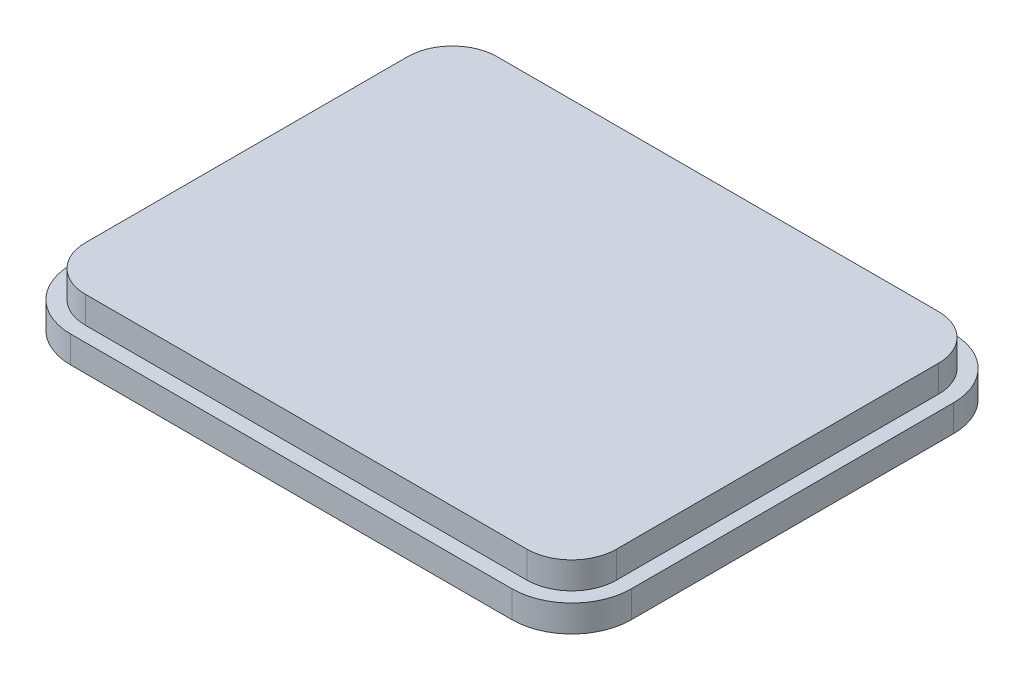
ISO-10303-21;
HEADER;
FILE_DESCRIPTION(('STEP AP214'),'2;1');
FILE_NAME('part.step','',(''),(''),'','','');
FILE_SCHEMA(('AUTOMOTIVE_DESIGN { 1 0 10303 214 1 1 1 1 }'));
ENDSEC;
DATA;
#1=APPLICATION_CONTEXT('core data for automotive mechanical design processes');
#2=APPLICATION_PROTOCOL_DEFINITION('international standard','automotive_design',2000,#1);
#3=PRODUCT_CONTEXT('',#1,'mechanical');
#4=PRODUCT('Part','Part','',(#3));
#5=PRODUCT_RELATED_PRODUCT_CATEGORY('part','',(#4));
#6=PRODUCT_DEFINITION_FORMATION('','',#4);
#7=PRODUCT_DEFINITION_CONTEXT('part definition',#1,'design');
#8=PRODUCT_DEFINITION('design','',#6,#7);
#9=PRODUCT_DEFINITION_SHAPE('','',#8);
#10=(LENGTH_UNIT() NAMED_UNIT(*) SI_UNIT(.MILLI.,.METRE.));
#11=(NAMED_UNIT(*) PLANE_ANGLE_UNIT() SI_UNIT($,.RADIAN.));
#12=(NAMED_UNIT(*) SI_UNIT($,.STERADIAN.) SOLID_ANGLE_UNIT());
#13=UNCERTAINTY_MEASURE_WITH_UNIT(LENGTH_MEASURE(1.E-05),#10,'distance_accuracy_value','');
#14=(GEOMETRIC_REPRESENTATION_CONTEXT(3) GLOBAL_UNCERTAINTY_ASSIGNED_CONTEXT((#13)) GLOBAL_UNIT_ASSIGNED_CONTEXT((#10,
#11,#12)) REPRESENTATION_CONTEXT('',''));
#15=CARTESIAN_POINT('',(0.,0.,0.));
#16=DIRECTION('',(0.,0.,1.));
#17=DIRECTION('',(1.,0.,0.));
#18=AXIS2_PLACEMENT_3D('',#15,#16,#17);
#19=CARTESIAN_POINT('',(0.,0.45,0.));
#20=DIRECTION('',(0.,1.,0.));
#21=DIRECTION('',(0.,0.,1.));
#22=AXIS2_PLACEMENT_3D('',#19,#20,#21);
#23=PLANE('',#22);
#24=DIRECTION('',(-1.,0.,0.));
#25=VECTOR('',#24,1.);
#26=CARTESIAN_POINT('',(-0.89,0.45,0.69));
#27=LINE('',#26,#25);
#28=CARTESIAN_POINT('',(-0.74,0.45,0.69));
#29=VERTEX_POINT('',#28);
#30=CARTESIAN_POINT('',(0.74,0.45,0.69));
#31=VERTEX_POINT('',#30);
#32=EDGE_CURVE('E130',#29,#31,#27,.F.);
#33=ORIENTED_EDGE('',*,*,#32,.T.);
#34=CARTESIAN_POINT('',(0.74,0.45,0.54));
#35=DIRECTION('',(0.,-1.,0.));
#36=DIRECTION('',(0.,0.,-1.));
#37=AXIS2_PLACEMENT_3D('',#34,#35,#36);
#38=CIRCLE('',#37,0.15);
#39=CARTESIAN_POINT('',(0.89,0.45,0.54));
#40=VERTEX_POINT('',#39);
#41=EDGE_CURVE('E148',#40,#31,#38,.T.);
#42=ORIENTED_EDGE('',*,*,#41,.F.);
#43=DIRECTION('',(0.,0.,1.));
#44=VECTOR('',#43,1.);
#45=CARTESIAN_POINT('',(0.89,0.45,-0.69));
#46=LINE('',#45,#44);
#47=CARTESIAN_POINT('',(0.89,0.45,-0.54));
#48=VERTEX_POINT('',#47);
#49=EDGE_CURVE('E151',#40,#48,#46,.F.);
#50=ORIENTED_EDGE('',*,*,#49,.T.);
#51=CARTESIAN_POINT('',(0.74,0.45,-0.54));
#52=DIRECTION('',(0.,-1.,0.));
#53=DIRECTION('',(0.,0.,-1.));
#54=AXIS2_PLACEMENT_3D('',#51,#52,#53);
#55=CIRCLE('',#54,0.15);
#56=CARTESIAN_POINT('',(0.74,0.45,-0.69));
#57=VERTEX_POINT('',#56);
#58=EDGE_CURVE('E197',#57,#48,#55,.T.);
#59=ORIENTED_EDGE('',*,*,#58,.F.);
#60=DIRECTION('',(1.,0.,0.));
#61=VECTOR('',#60,1.);
#62=CARTESIAN_POINT('',(-0.89,0.45,-0.69));
#63=LINE('',#62,#61);
#64=CARTESIAN_POINT('',(-0.74,0.45,-0.69));
#65=VERTEX_POINT('',#64);
#66=EDGE_CURVE('E196',#57,#65,#63,.F.);
#67=ORIENTED_EDGE('',*,*,#66,.T.);
#68=CARTESIAN_POINT('',(-0.74,0.45,-0.54));
#69=DIRECTION('',(0.,-1.,0.));
#70=DIRECTION('',(0.,0.,-1.));
#71=AXIS2_PLACEMENT_3D('',#68,#69,#70);
#72=CIRCLE('',#71,0.15);
#73=CARTESIAN_POINT('',(-0.89,0.45,-0.54));
#74=VERTEX_POINT('',#73);
#75=EDGE_CURVE('E192',#74,#65,#72,.T.);
#76=ORIENTED_EDGE('',*,*,#75,.F.);
#77=DIRECTION('',(0.,0.,-1.));
#78=VECTOR('',#77,1.);
#79=CARTESIAN_POINT('',(-0.89,0.45,-0.69));
#80=LINE('',#79,#78);
#81=CARTESIAN_POINT('',(-0.89,0.45,0.54));
#82=VERTEX_POINT('',#81);
#83=EDGE_CURVE('E133',#74,#82,#80,.F.);
#84=ORIENTED_EDGE('',*,*,#83,.T.);
#85=CARTESIAN_POINT('',(-0.74,0.45,0.54));
#86=DIRECTION('',(0.,-1.,0.));
#87=DIRECTION('',(0.,0.,-1.));
#88=AXIS2_PLACEMENT_3D('',#85,#86,#87);
#89=CIRCLE('',#88,0.15);
#90=EDGE_CURVE('E20',#29,#82,#89,.T.);
#91=ORIENTED_EDGE('',*,*,#90,.F.);
#92=EDGE_LOOP('',(#33,#42,#50,#59,#67,#76,#84,#91));
#93=FACE_BOUND('',#92,.T.);
#94=ADVANCED_FACE('F17',(#93),#23,.T.);
#95=CARTESIAN_POINT('',(-0.74,0.45,0.54));
#96=DIRECTION('',(0.,-1.,0.));
#97=DIRECTION('',(0.,0.,-1.));
#98=AXIS2_PLACEMENT_3D('',#95,#96,#97);
#99=CYLINDRICAL_SURFACE('',#98,0.15);
#100=CARTESIAN_POINT('',(-0.74,0.36,0.54));
#101=DIRECTION('',(0.,-1.,0.));
#102=DIRECTION('',(0.,0.,-1.));
#103=AXIS2_PLACEMENT_3D('',#100,#101,#102);
#104=CIRCLE('',#103,0.15);
#105=CARTESIAN_POINT('',(-0.89,0.36,0.54));
#106=VERTEX_POINT('',#105);
#107=CARTESIAN_POINT('',(-0.74,0.36,0.69));
#108=VERTEX_POINT('',#107);
#109=EDGE_CURVE('E140',#106,#108,#104,.F.);
#110=ORIENTED_EDGE('',*,*,#109,.T.);
#111=DIRECTION('',(0.,1.,0.));
#112=VECTOR('',#111,1.);
#113=CARTESIAN_POINT('',(-0.74,0.45,0.69));
#114=LINE('',#113,#112);
#115=EDGE_CURVE('E136',#108,#29,#114,.T.);
#116=ORIENTED_EDGE('',*,*,#115,.T.);
#117=ORIENTED_EDGE('',*,*,#90,.T.);
#118=DIRECTION('',(0.,1.,0.));
#119=VECTOR('',#118,1.);
#120=CARTESIAN_POINT('',(-0.89,0.45,0.54));
#121=LINE('',#120,#119);
#122=EDGE_CURVE('E222',#82,#106,#121,.F.);
#123=ORIENTED_EDGE('',*,*,#122,.T.);
#124=EDGE_LOOP('',(#110,#116,#117,#123));
#125=FACE_BOUND('',#124,.T.);
#126=ADVANCED_FACE('F138',(#125),#99,.T.);
#127=CARTESIAN_POINT('',(-0.89,0.45,0.69));
#128=DIRECTION('',(0.,0.,-1.));
#129=DIRECTION('',(-1.,0.,0.));
#130=AXIS2_PLACEMENT_3D('',#127,#128,#129);
#131=PLANE('',#130);
#132=DIRECTION('',(0.,-1.,0.));
#133=VECTOR('',#132,1.);
#134=CARTESIAN_POINT('',(0.74,0.45,0.69));
#135=LINE('',#134,#133);
#136=CARTESIAN_POINT('',(0.74,0.36,0.69));
#137=VERTEX_POINT('',#136);
#138=EDGE_CURVE('E146',#31,#137,#135,.T.);
#139=ORIENTED_EDGE('',*,*,#138,.F.);
#140=ORIENTED_EDGE('',*,*,#32,.F.);
#141=ORIENTED_EDGE('',*,*,#115,.F.);
#142=DIRECTION('',(1.,0.,0.));
#143=VECTOR('',#142,1.);
#144=CARTESIAN_POINT('',(0.,0.36,0.69));
#145=LINE('',#144,#143);
#146=EDGE_CURVE('E188',#108,#137,#145,.T.);
#147=ORIENTED_EDGE('',*,*,#146,.T.);
#148=EDGE_LOOP('',(#139,#140,#141,#147));
#149=FACE_BOUND('',#148,.T.);
#150=ADVANCED_FACE('F144',(#149),#131,.F.);
#151=CARTESIAN_POINT('',(0.74,0.45,0.54));
#152=DIRECTION('',(0.,-1.,0.));
#153=DIRECTION('',(0.,0.,-1.));
#154=AXIS2_PLACEMENT_3D('',#151,#152,#153);
#155=CYLINDRICAL_SURFACE('',#154,0.15);
#156=CARTESIAN_POINT('',(0.74,0.36,0.54));
#157=DIRECTION('',(0.,-1.,0.));
#158=DIRECTION('',(0.,0.,-1.));
#159=AXIS2_PLACEMENT_3D('',#156,#157,#158);
#160=CIRCLE('',#159,0.15);
#161=CARTESIAN_POINT('',(0.89,0.36,0.54));
#162=VERTEX_POINT('',#161);
#163=EDGE_CURVE('E186',#137,#162,#160,.F.);
#164=ORIENTED_EDGE('',*,*,#163,.T.);
#165=DIRECTION('',(0.,1.,0.));
#166=VECTOR('',#165,1.);
#167=CARTESIAN_POINT('',(0.89,0.45,0.54));
#168=LINE('',#167,#166);
#169=EDGE_CURVE('E205',#162,#40,#168,.T.);
#170=ORIENTED_EDGE('',*,*,#169,.T.);
#171=ORIENTED_EDGE('',*,*,#41,.T.);
#172=ORIENTED_EDGE('',*,*,#138,.T.);
#173=EDGE_LOOP('',(#164,#170,#171,#172));
#174=FACE_BOUND('',#173,.T.);
#175=ADVANCED_FACE('F419',(#174),#155,.T.);
#176=CARTESIAN_POINT('',(0.89,0.45,-0.69));
#177=DIRECTION('',(-1.,0.,0.));
#178=DIRECTION('',(0.,0.,1.));
#179=AXIS2_PLACEMENT_3D('',#176,#177,#178);
#180=PLANE('',#179);
#181=DIRECTION('',(0.,-1.,0.));
#182=VECTOR('',#181,1.);
#183=CARTESIAN_POINT('',(0.89,0.45,-0.54));
#184=LINE('',#183,#182);
#185=CARTESIAN_POINT('',(0.89,0.36,-0.54));
#186=VERTEX_POINT('',#185);
#187=EDGE_CURVE('E199',#48,#186,#184,.T.);
#188=ORIENTED_EDGE('',*,*,#187,.F.);
#189=ORIENTED_EDGE('',*,*,#49,.F.);
#190=ORIENTED_EDGE('',*,*,#169,.F.);
#191=DIRECTION('',(0.,0.,-1.));
#192=VECTOR('',#191,1.);
#193=CARTESIAN_POINT('',(0.89,0.36,0.));
#194=LINE('',#193,#192);
#195=EDGE_CURVE('E185',#162,#186,#194,.T.);
#196=ORIENTED_EDGE('',*,*,#195,.T.);
#197=EDGE_LOOP('',(#188,#189,#190,#196));
#198=FACE_BOUND('',#197,.T.);
#199=ADVANCED_FACE('F411',(#198),#180,.F.);
#200=CARTESIAN_POINT('',(0.74,0.45,-0.54));
#201=DIRECTION('',(0.,-1.,0.));
#202=DIRECTION('',(0.,0.,-1.));
#203=AXIS2_PLACEMENT_3D('',#200,#201,#202);
#204=CYLINDRICAL_SURFACE('',#203,0.15);
#205=CARTESIAN_POINT('',(0.74,0.36,-0.54));
#206=DIRECTION('',(0.,-1.,0.));
#207=DIRECTION('',(0.,0.,-1.));
#208=AXIS2_PLACEMENT_3D('',#205,#206,#207);
#209=CIRCLE('',#208,0.15);
#210=CARTESIAN_POINT('',(0.74,0.36,-0.69));
#211=VERTEX_POINT('',#210);
#212=EDGE_CURVE('E183',#186,#211,#209,.F.);
#213=ORIENTED_EDGE('',*,*,#212,.T.);
#214=DIRECTION('',(0.,1.,0.));
#215=VECTOR('',#214,1.);
#216=CARTESIAN_POINT('',(0.74,0.45,-0.69));
#217=LINE('',#216,#215);
#218=EDGE_CURVE('E203',#211,#57,#217,.T.);
#219=ORIENTED_EDGE('',*,*,#218,.T.);
#220=ORIENTED_EDGE('',*,*,#58,.T.);
#221=ORIENTED_EDGE('',*,*,#187,.T.);
#222=EDGE_LOOP('',(#213,#219,#220,#221));
#223=FACE_BOUND('',#222,.T.);
#224=ADVANCED_FACE('F402',(#223),#204,.T.);
#225=CARTESIAN_POINT('',(-0.89,0.45,-0.69));
#226=DIRECTION('',(0.,0.,1.));
#227=DIRECTION('',(1.,0.,0.));
#228=AXIS2_PLACEMENT_3D('',#225,#226,#227);
#229=PLANE('',#228);
#230=ORIENTED_EDGE('',*,*,#218,.F.);
#231=DIRECTION('',(1.,0.,0.));
#232=VECTOR('',#231,1.);
#233=CARTESIAN_POINT('',(0.,0.36,-0.69));
#234=LINE('',#233,#232);
#235=CARTESIAN_POINT('',(-0.74,0.36,-0.69));
#236=VERTEX_POINT('',#235);
#237=EDGE_CURVE('E182',#211,#236,#234,.F.);
#238=ORIENTED_EDGE('',*,*,#237,.T.);
#239=DIRECTION('',(0.,-1.,0.));
#240=VECTOR('',#239,1.);
#241=CARTESIAN_POINT('',(-0.74,0.45,-0.69));
#242=LINE('',#241,#240);
#243=EDGE_CURVE('E195',#65,#236,#242,.T.);
#244=ORIENTED_EDGE('',*,*,#243,.F.);
#245=ORIENTED_EDGE('',*,*,#66,.F.);
#246=EDGE_LOOP('',(#230,#238,#244,#245));
#247=FACE_BOUND('',#246,.T.);
#248=ADVANCED_FACE('F393',(#247),#229,.F.);
#249=CARTESIAN_POINT('',(-0.74,0.45,-0.54));
#250=DIRECTION('',(0.,-1.,0.));
#251=DIRECTION('',(0.,0.,-1.));
#252=AXIS2_PLACEMENT_3D('',#249,#250,#251);
#253=CYLINDRICAL_SURFACE('',#252,0.15);
#254=CARTESIAN_POINT('',(-0.74,0.36,-0.54));
#255=DIRECTION('',(0.,-1.,0.));
#256=DIRECTION('',(0.,0.,-1.));
#257=AXIS2_PLACEMENT_3D('',#254,#255,#256);
#258=CIRCLE('',#257,0.15);
#259=CARTESIAN_POINT('',(-0.89,0.36,-0.54));
#260=VERTEX_POINT('',#259);
#261=EDGE_CURVE('E179',#236,#260,#258,.F.);
#262=ORIENTED_EDGE('',*,*,#261,.T.);
#263=DIRECTION('',(0.,1.,0.));
#264=VECTOR('',#263,1.);
#265=CARTESIAN_POINT('',(-0.89,0.45,-0.54));
#266=LINE('',#265,#264);
#267=EDGE_CURVE('E215',#260,#74,#266,.T.);
#268=ORIENTED_EDGE('',*,*,#267,.T.);
#269=ORIENTED_EDGE('',*,*,#75,.T.);
#270=ORIENTED_EDGE('',*,*,#243,.T.);
#271=EDGE_LOOP('',(#262,#268,#269,#270));
#272=FACE_BOUND('',#271,.T.);
#273=ADVANCED_FACE('F384',(#272),#253,.T.);
#274=CARTESIAN_POINT('',(-0.89,0.45,-0.69));
#275=DIRECTION('',(1.,0.,0.));
#276=DIRECTION('',(0.,0.,-1.));
#277=AXIS2_PLACEMENT_3D('',#274,#275,#276);
#278=PLANE('',#277);
#279=ORIENTED_EDGE('',*,*,#267,.F.);
#280=DIRECTION('',(0.,0.,-1.));
#281=VECTOR('',#280,1.);
#282=CARTESIAN_POINT('',(-0.89,0.36,0.));
#283=LINE('',#282,#281);
#284=EDGE_CURVE('E181',#260,#106,#283,.F.);
#285=ORIENTED_EDGE('',*,*,#284,.T.);
#286=ORIENTED_EDGE('',*,*,#122,.F.);
#287=ORIENTED_EDGE('',*,*,#83,.F.);
#288=EDGE_LOOP('',(#279,#285,#286,#287));
#289=FACE_BOUND('',#288,.T.);
#290=ADVANCED_FACE('F375',(#289),#278,.F.);
#291=CARTESIAN_POINT('',(0.,0.36,0.));
#292=DIRECTION('',(0.,-1.,0.));
#293=DIRECTION('',(0.,0.,-1.));
#294=AXIS2_PLACEMENT_3D('',#291,#292,#293);
#295=PLANE('',#294);
#296=ORIENTED_EDGE('',*,*,#261,.F.);
#297=ORIENTED_EDGE('',*,*,#237,.F.);
#298=ORIENTED_EDGE('',*,*,#212,.F.);
#299=ORIENTED_EDGE('',*,*,#195,.F.);
#300=ORIENTED_EDGE('',*,*,#163,.F.);
#301=ORIENTED_EDGE('',*,*,#146,.F.);
#302=ORIENTED_EDGE('',*,*,#109,.F.);
#303=ORIENTED_EDGE('',*,*,#284,.F.);
#304=EDGE_LOOP('',(#296,#297,#298,#299,#300,#301,#302,#303));
#305=FACE_BOUND('',#304,.T.);
#306=DIRECTION('',(-1.,0.,0.));
#307=VECTOR('',#306,1.);
#308=CARTESIAN_POINT('',(-0.94,0.36,0.74));
#309=LINE('',#308,#307);
#310=CARTESIAN_POINT('',(-0.74,0.36,0.74));
#311=VERTEX_POINT('',#310);
#312=CARTESIAN_POINT('',(0.74,0.36,0.74));
#313=VERTEX_POINT('',#312);
#314=EDGE_CURVE('E178',#311,#313,#309,.F.);
#315=ORIENTED_EDGE('',*,*,#314,.T.);
#316=CARTESIAN_POINT('',(0.74,0.36,0.54));
#317=DIRECTION('',(0.,-1.,0.));
#318=DIRECTION('',(0.,0.,-1.));
#319=AXIS2_PLACEMENT_3D('',#316,#317,#318);
#320=CIRCLE('',#319,0.2);
#321=CARTESIAN_POINT('',(0.94,0.36,0.54));
#322=VERTEX_POINT('',#321);
#323=EDGE_CURVE('E190',#322,#313,#320,.T.);
#324=ORIENTED_EDGE('',*,*,#323,.F.);
#325=DIRECTION('',(0.,0.,1.));
#326=VECTOR('',#325,1.);
#327=CARTESIAN_POINT('',(0.94,0.36,0.74));
#328=LINE('',#327,#326);
#329=CARTESIAN_POINT('',(0.94,0.36,-0.54));
#330=VERTEX_POINT('',#329);
#331=EDGE_CURVE('E238',#322,#330,#328,.F.);
#332=ORIENTED_EDGE('',*,*,#331,.T.);
#333=CARTESIAN_POINT('',(0.74,0.36,-0.54));
#334=DIRECTION('',(0.,-1.,0.));
#335=DIRECTION('',(0.,0.,-1.));
#336=AXIS2_PLACEMENT_3D('',#333,#334,#335);
#337=CIRCLE('',#336,0.2);
#338=CARTESIAN_POINT('',(0.74,0.36,-0.74));
#339=VERTEX_POINT('',#338);
#340=EDGE_CURVE('E166',#339,#330,#337,.T.);
#341=ORIENTED_EDGE('',*,*,#340,.F.);
#342=DIRECTION('',(1.,0.,0.));
#343=VECTOR('',#342,1.);
#344=CARTESIAN_POINT('',(-0.94,0.36,-0.74));
#345=LINE('',#344,#343);
#346=CARTESIAN_POINT('',(-0.74,0.36,-0.74));
#347=VERTEX_POINT('',#346);
#348=EDGE_CURVE('E169',#339,#347,#345,.F.);
#349=ORIENTED_EDGE('',*,*,#348,.T.);
#350=CARTESIAN_POINT('',(-0.74,0.36,-0.54));
#351=DIRECTION('',(0.,-1.,0.));
#352=DIRECTION('',(0.,0.,-1.));
#353=AXIS2_PLACEMENT_3D('',#350,#351,#352);
#354=CIRCLE('',#353,0.2);
#355=CARTESIAN_POINT('',(-0.94,0.36,-0.54));
#356=VERTEX_POINT('',#355);
#357=EDGE_CURVE('E170',#356,#347,#354,.T.);
#358=ORIENTED_EDGE('',*,*,#357,.F.);
#359=DIRECTION('',(0.,0.,-1.));
#360=VECTOR('',#359,1.);
#361=CARTESIAN_POINT('',(-0.94,0.36,0.74));
#362=LINE('',#361,#360);
#363=CARTESIAN_POINT('',(-0.94,0.36,0.54));
#364=VERTEX_POINT('',#363);
#365=EDGE_CURVE('E226',#356,#364,#362,.F.);
#366=ORIENTED_EDGE('',*,*,#365,.T.);
#367=CARTESIAN_POINT('',(-0.74,0.36,0.54));
#368=DIRECTION('',(0.,-1.,0.));
#369=DIRECTION('',(0.,0.,-1.));
#370=AXIS2_PLACEMENT_3D('',#367,#368,#369);
#371=CIRCLE('',#370,0.2);
#372=EDGE_CURVE('E174',#311,#364,#371,.T.);
#373=ORIENTED_EDGE('',*,*,#372,.F.);
#374=EDGE_LOOP('',(#315,#324,#332,#341,#349,#358,#366,#373));
#375=FACE_BOUND('',#374,.T.);
#376=ADVANCED_FACE('F271',(#305,#375),#295,.F.);
#377=CARTESIAN_POINT('',(-0.94,0.36,0.74));
#378=DIRECTION('',(0.,0.,-1.));
#379=DIRECTION('',(-1.,0.,0.));
#380=AXIS2_PLACEMENT_3D('',#377,#378,#379);
#381=PLANE('',#380);
#382=DIRECTION('',(0.,-1.,0.));
#383=VECTOR('',#382,1.);
#384=CARTESIAN_POINT('',(-0.74,0.36,0.74));
#385=LINE('',#384,#383);
#386=CARTESIAN_POINT('',(-0.74,0.27,0.74));
#387=VERTEX_POINT('',#386);
#388=EDGE_CURVE('E177',#387,#311,#385,.F.);
#389=ORIENTED_EDGE('',*,*,#388,.F.);
#390=DIRECTION('',(1.,0.,0.));
#391=VECTOR('',#390,1.);
#392=CARTESIAN_POINT('',(0.,0.27,0.74));
#393=LINE('',#392,#391);
#394=CARTESIAN_POINT('',(0.74,0.27,0.74));
#395=VERTEX_POINT('',#394);
#396=EDGE_CURVE('E165',#395,#387,#393,.F.);
#397=ORIENTED_EDGE('',*,*,#396,.F.);
#398=DIRECTION('',(0.,-1.,0.));
#399=VECTOR('',#398,1.);
#400=CARTESIAN_POINT('',(0.74,0.36,0.74));
#401=LINE('',#400,#399);
#402=EDGE_CURVE('E241',#313,#395,#401,.T.);
#403=ORIENTED_EDGE('',*,*,#402,.F.);
#404=ORIENTED_EDGE('',*,*,#314,.F.);
#405=EDGE_LOOP('',(#389,#397,#403,#404));
#406=FACE_BOUND('',#405,.T.);
#407=ADVANCED_FACE('F277',(#406),#381,.F.);
#408=CARTESIAN_POINT('',(-0.74,0.36,0.54));
#409=DIRECTION('',(0.,-1.,0.));
#410=DIRECTION('',(0.,0.,-1.));
#411=AXIS2_PLACEMENT_3D('',#408,#409,#410);
#412=CYLINDRICAL_SURFACE('',#411,0.2);
#413=CARTESIAN_POINT('',(-0.74,0.27,0.54));
#414=DIRECTION('',(0.,-1.,0.));
#415=DIRECTION('',(0.,0.,-1.));
#416=AXIS2_PLACEMENT_3D('',#413,#414,#415);
#417=CIRCLE('',#416,0.2);
#418=CARTESIAN_POINT('',(-0.94,0.27,0.54));
#419=VERTEX_POINT('',#418);
#420=EDGE_CURVE('E162',#387,#419,#417,.T.);
#421=ORIENTED_EDGE('',*,*,#420,.F.);
#422=ORIENTED_EDGE('',*,*,#388,.T.);
#423=ORIENTED_EDGE('',*,*,#372,.T.);
#424=DIRECTION('',(0.,1.,0.));
#425=VECTOR('',#424,1.);
#426=CARTESIAN_POINT('',(-0.94,0.36,0.54));
#427=LINE('',#426,#425);
#428=EDGE_CURVE('E173',#364,#419,#427,.F.);
#429=ORIENTED_EDGE('',*,*,#428,.T.);
#430=EDGE_LOOP('',(#421,#422,#423,#429));
#431=FACE_BOUND('',#430,.T.);
#432=ADVANCED_FACE('F281',(#431),#412,.T.);
#433=CARTESIAN_POINT('',(-0.94,0.36,0.74));
#434=DIRECTION('',(1.,0.,0.));
#435=DIRECTION('',(0.,0.,-1.));
#436=AXIS2_PLACEMENT_3D('',#433,#434,#435);
#437=PLANE('',#436);
#438=ORIENTED_EDGE('',*,*,#428,.F.);
#439=ORIENTED_EDGE('',*,*,#365,.F.);
#440=DIRECTION('',(0.,-1.,0.));
#441=VECTOR('',#440,1.);
#442=CARTESIAN_POINT('',(-0.94,0.36,-0.54));
#443=LINE('',#442,#441);
#444=CARTESIAN_POINT('',(-0.94,0.27,-0.54));
#445=VERTEX_POINT('',#444);
#446=EDGE_CURVE('E172',#445,#356,#443,.F.);
#447=ORIENTED_EDGE('',*,*,#446,.F.);
#448=DIRECTION('',(0.,0.,-1.));
#449=VECTOR('',#448,1.);
#450=CARTESIAN_POINT('',(-0.94,0.27,0.));
#451=LINE('',#450,#449);
#452=EDGE_CURVE('E161',#419,#445,#451,.T.);
#453=ORIENTED_EDGE('',*,*,#452,.F.);
#454=EDGE_LOOP('',(#438,#439,#447,#453));
#455=FACE_BOUND('',#454,.T.);
#456=ADVANCED_FACE('F285',(#455),#437,.F.);
#457=CARTESIAN_POINT('',(-0.74,0.36,-0.54));
#458=DIRECTION('',(0.,-1.,0.));
#459=DIRECTION('',(0.,0.,-1.));
#460=AXIS2_PLACEMENT_3D('',#457,#458,#459);
#461=CYLINDRICAL_SURFACE('',#460,0.2);
#462=CARTESIAN_POINT('',(-0.74,0.27,-0.54));
#463=DIRECTION('',(0.,-1.,0.));
#464=DIRECTION('',(0.,0.,-1.));
#465=AXIS2_PLACEMENT_3D('',#462,#463,#464);
#466=CIRCLE('',#465,0.2);
#467=CARTESIAN_POINT('',(-0.74,0.27,-0.74));
#468=VERTEX_POINT('',#467);
#469=EDGE_CURVE('E158',#445,#468,#466,.T.);
#470=ORIENTED_EDGE('',*,*,#469,.F.);
#471=ORIENTED_EDGE('',*,*,#446,.T.);
#472=ORIENTED_EDGE('',*,*,#357,.T.);
#473=DIRECTION('',(0.,1.,0.));
#474=VECTOR('',#473,1.);
#475=CARTESIAN_POINT('',(-0.74,0.36,-0.74));
#476=LINE('',#475,#474);
#477=EDGE_CURVE('E230',#347,#468,#476,.F.);
#478=ORIENTED_EDGE('',*,*,#477,.T.);
#479=EDGE_LOOP('',(#470,#471,#472,#478));
#480=FACE_BOUND('',#479,.T.);
#481=ADVANCED_FACE('F288',(#480),#461,.T.);
#482=CARTESIAN_POINT('',(-0.94,0.36,-0.74));
#483=DIRECTION('',(0.,0.,1.));
#484=DIRECTION('',(1.,0.,0.));
#485=AXIS2_PLACEMENT_3D('',#482,#483,#484);
#486=PLANE('',#485);
#487=DIRECTION('',(0.,-1.,0.));
#488=VECTOR('',#487,1.);
#489=CARTESIAN_POINT('',(0.74,0.36,-0.74));
#490=LINE('',#489,#488);
#491=CARTESIAN_POINT('',(0.74,0.27,-0.74));
#492=VERTEX_POINT('',#491);
#493=EDGE_CURVE('E168',#492,#339,#490,.F.);
#494=ORIENTED_EDGE('',*,*,#493,.F.);
#495=DIRECTION('',(1.,0.,0.));
#496=VECTOR('',#495,1.);
#497=CARTESIAN_POINT('',(0.,0.27,-0.74));
#498=LINE('',#497,#496);
#499=EDGE_CURVE('E157',#468,#492,#498,.T.);
#500=ORIENTED_EDGE('',*,*,#499,.F.);
#501=ORIENTED_EDGE('',*,*,#477,.F.);
#502=ORIENTED_EDGE('',*,*,#348,.F.);
#503=EDGE_LOOP('',(#494,#500,#501,#502));
#504=FACE_BOUND('',#503,.T.);
#505=ADVANCED_FACE('F292',(#504),#486,.F.);
#506=CARTESIAN_POINT('',(0.74,0.36,-0.54));
#507=DIRECTION('',(0.,-1.,0.));
#508=DIRECTION('',(0.,0.,-1.));
#509=AXIS2_PLACEMENT_3D('',#506,#507,#508);
#510=CYLINDRICAL_SURFACE('',#509,0.2);
#511=CARTESIAN_POINT('',(0.74,0.27,-0.54));
#512=DIRECTION('',(0.,-1.,0.));
#513=DIRECTION('',(0.,0.,-1.));
#514=AXIS2_PLACEMENT_3D('',#511,#512,#513);
#515=CIRCLE('',#514,0.2);
#516=CARTESIAN_POINT('',(0.94,0.27,-0.54));
#517=VERTEX_POINT('',#516);
#518=EDGE_CURVE('E154',#492,#517,#515,.T.);
#519=ORIENTED_EDGE('',*,*,#518,.F.);
#520=ORIENTED_EDGE('',*,*,#493,.T.);
#521=ORIENTED_EDGE('',*,*,#340,.T.);
#522=DIRECTION('',(0.,1.,0.));
#523=VECTOR('',#522,1.);
#524=CARTESIAN_POINT('',(0.94,0.36,-0.54));
#525=LINE('',#524,#523);
#526=EDGE_CURVE('E242',#330,#517,#525,.F.);
#527=ORIENTED_EDGE('',*,*,#526,.T.);
#528=EDGE_LOOP('',(#519,#520,#521,#527));
#529=FACE_BOUND('',#528,.T.);
#530=ADVANCED_FACE('F268',(#529),#510,.T.);
#531=CARTESIAN_POINT('',(0.94,0.36,0.74));
#532=DIRECTION('',(-1.,0.,0.));
#533=DIRECTION('',(0.,0.,1.));
#534=AXIS2_PLACEMENT_3D('',#531,#532,#533);
#535=PLANE('',#534);
#536=DIRECTION('',(0.,-1.,0.));
#537=VECTOR('',#536,1.);
#538=CARTESIAN_POINT('',(0.94,0.36,0.54));
#539=LINE('',#538,#537);
#540=CARTESIAN_POINT('',(0.94,0.27,0.54));
#541=VERTEX_POINT('',#540);
#542=EDGE_CURVE('E35',#541,#322,#539,.F.);
#543=ORIENTED_EDGE('',*,*,#542,.F.);
#544=DIRECTION('',(0.,0.,-1.));
#545=VECTOR('',#544,1.);
#546=CARTESIAN_POINT('',(0.94,0.27,0.));
#547=LINE('',#546,#545);
#548=EDGE_CURVE('E26',#517,#541,#547,.F.);
#549=ORIENTED_EDGE('',*,*,#548,.F.);
#550=ORIENTED_EDGE('',*,*,#526,.F.);
#551=ORIENTED_EDGE('',*,*,#331,.F.);
#552=EDGE_LOOP('',(#543,#549,#550,#551));
#553=FACE_BOUND('',#552,.T.);
#554=ADVANCED_FACE('F266',(#553),#535,.F.);
#555=CARTESIAN_POINT('',(0.74,0.36,0.54));
#556=DIRECTION('',(0.,-1.,0.));
#557=DIRECTION('',(0.,0.,-1.));
#558=AXIS2_PLACEMENT_3D('',#555,#556,#557);
#559=CYLINDRICAL_SURFACE('',#558,0.2);
#560=CARTESIAN_POINT('',(0.74,0.27,0.54));
#561=DIRECTION('',(0.,-1.,0.));
#562=DIRECTION('',(0.,0.,-1.));
#563=AXIS2_PLACEMENT_3D('',#560,#561,#562);
#564=CIRCLE('',#563,0.2);
#565=EDGE_CURVE('E11',#541,#395,#564,.T.);
#566=ORIENTED_EDGE('',*,*,#565,.F.);
#567=ORIENTED_EDGE('',*,*,#542,.T.);
#568=ORIENTED_EDGE('',*,*,#323,.T.);
#569=ORIENTED_EDGE('',*,*,#402,.T.);
#570=EDGE_LOOP('',(#566,#567,#568,#569));
#571=FACE_BOUND('',#570,.T.);
#572=ADVANCED_FACE('F275',(#571),#559,.T.);
#573=CARTESIAN_POINT('',(0.,0.27,0.));
#574=DIRECTION('',(0.,-1.,0.));
#575=DIRECTION('',(0.,0.,-1.));
#576=AXIS2_PLACEMENT_3D('',#573,#574,#575);
#577=PLANE('',#576);
#578=ORIENTED_EDGE('',*,*,#548,.T.);
#579=ORIENTED_EDGE('',*,*,#565,.T.);
#580=ORIENTED_EDGE('',*,*,#396,.T.);
#581=ORIENTED_EDGE('',*,*,#420,.T.);
#582=ORIENTED_EDGE('',*,*,#452,.T.);
#583=ORIENTED_EDGE('',*,*,#469,.T.);
#584=ORIENTED_EDGE('',*,*,#499,.T.);
#585=ORIENTED_EDGE('',*,*,#518,.T.);
#586=EDGE_LOOP('',(#578,#579,#580,#581,#582,#583,#584,#585));
#587=FACE_BOUND('',#586,.T.);
#588=ADVANCED_FACE('F263',(#587),#577,.T.);
#589=CLOSED_SHELL('',(#94,#126,#150,#175,#199,#224,#248,#273,#290,#376,#407,#432,#456,#481,#505,
#530,#554,#572,#588));
#590=MANIFOLD_SOLID_BREP('B1',#589);
#591=ADVANCED_BREP_SHAPE_REPRESENTATION('',(#18,#590),#14);
#592=SHAPE_DEFINITION_REPRESENTATION(#9,#591);
ENDSEC;
END-ISO-10303-21;
